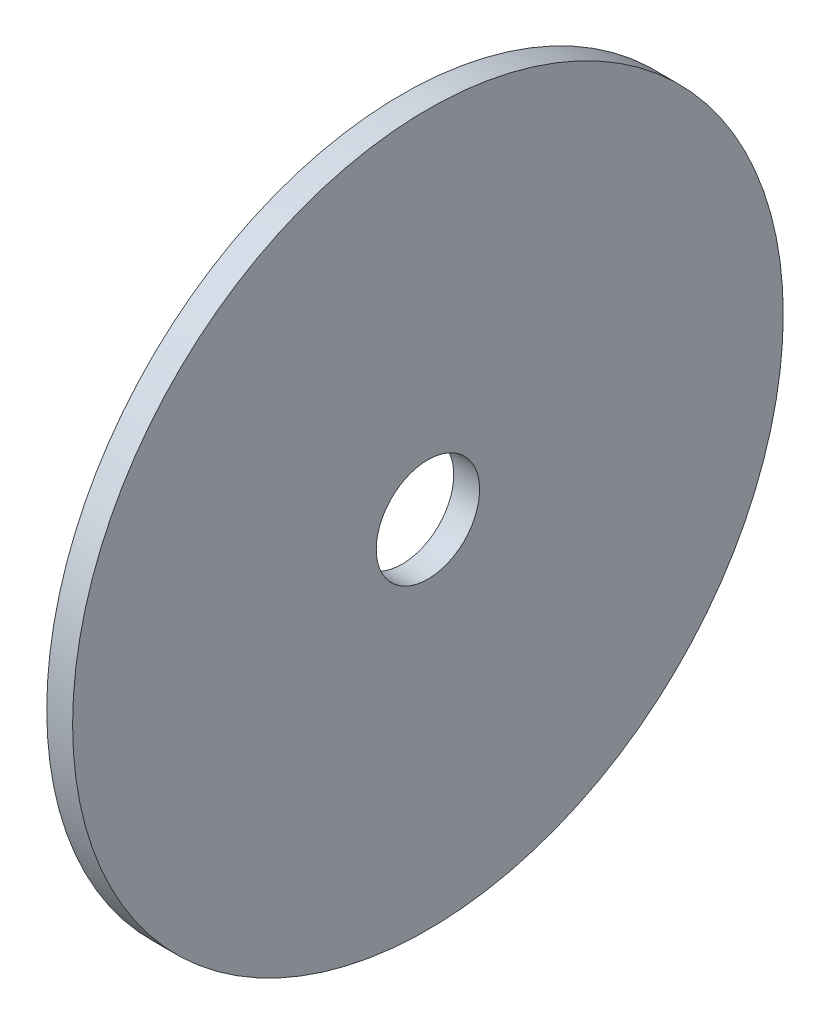
ISO-10303-21;
HEADER;
FILE_DESCRIPTION(('STEP AP214'),'2;1');
FILE_NAME('part.step','',(''),(''),'','','');
FILE_SCHEMA(('AUTOMOTIVE_DESIGN { 1 0 10303 214 1 1 1 1 }'));
ENDSEC;
DATA;
#1=APPLICATION_CONTEXT('core data for automotive mechanical design processes');
#2=APPLICATION_PROTOCOL_DEFINITION('international standard','automotive_design',2000,#1);
#3=PRODUCT_CONTEXT('',#1,'mechanical');
#4=PRODUCT('Part','Part','',(#3));
#5=PRODUCT_RELATED_PRODUCT_CATEGORY('part','',(#4));
#6=PRODUCT_DEFINITION_FORMATION('','',#4);
#7=PRODUCT_DEFINITION_CONTEXT('part definition',#1,'design');
#8=PRODUCT_DEFINITION('design','',#6,#7);
#9=PRODUCT_DEFINITION_SHAPE('','',#8);
#10=(LENGTH_UNIT() NAMED_UNIT(*) SI_UNIT(.MILLI.,.METRE.));
#11=(NAMED_UNIT(*) PLANE_ANGLE_UNIT() SI_UNIT($,.RADIAN.));
#12=(NAMED_UNIT(*) SI_UNIT($,.STERADIAN.) SOLID_ANGLE_UNIT());
#13=UNCERTAINTY_MEASURE_WITH_UNIT(LENGTH_MEASURE(1.E-05),#10,'distance_accuracy_value','');
#14=(GEOMETRIC_REPRESENTATION_CONTEXT(3) GLOBAL_UNCERTAINTY_ASSIGNED_CONTEXT((#13)) GLOBAL_UNIT_ASSIGNED_CONTEXT((#10,
#11,#12)) REPRESENTATION_CONTEXT('',''));
#15=CARTESIAN_POINT('',(0.,0.,0.));
#16=DIRECTION('',(0.,0.,1.));
#17=DIRECTION('',(1.,0.,0.));
#18=AXIS2_PLACEMENT_3D('',#15,#16,#17);
#19=CARTESIAN_POINT('',(-130.,55.,0.));
#20=DIRECTION('',(1.,0.,0.));
#21=DIRECTION('',(0.,0.,-1.));
#22=AXIS2_PLACEMENT_3D('',#19,#20,#21);
#23=PLANE('',#22);
#24=CARTESIAN_POINT('',(-130.,0.,0.));
#25=DIRECTION('',(-1.,0.,0.));
#26=DIRECTION('',(0.,0.,1.));
#27=AXIS2_PLACEMENT_3D('',#24,#25,#26);
#28=CIRCLE('',#27,8.);
#29=CARTESIAN_POINT('',(-130.,0.,8.));
#30=VERTEX_POINT('',#29);
#31=EDGE_CURVE('E10',#30,#30,#28,.T.);
#32=ORIENTED_EDGE('',*,*,#31,.F.);
#33=EDGE_LOOP('',(#32));
#34=FACE_BOUND('',#33,.T.);
#35=CARTESIAN_POINT('',(-130.,0.,0.));
#36=DIRECTION('',(-1.,0.,0.));
#37=DIRECTION('',(0.,0.,1.));
#38=AXIS2_PLACEMENT_3D('',#35,#36,#37);
#39=CIRCLE('',#38,55.);
#40=CARTESIAN_POINT('',(-130.,0.,55.));
#41=VERTEX_POINT('',#40);
#42=EDGE_CURVE('E45',#41,#41,#39,.T.);
#43=ORIENTED_EDGE('',*,*,#42,.T.);
#44=EDGE_LOOP('',(#43));
#45=FACE_BOUND('',#44,.T.);
#46=ADVANCED_FACE('F31',(#34,#45),#23,.F.);
#47=CARTESIAN_POINT('',(-110.,0.,0.));
#48=DIRECTION('',(-1.,0.,0.));
#49=DIRECTION('',(0.,0.,1.));
#50=AXIS2_PLACEMENT_3D('',#47,#48,#49);
#51=CYLINDRICAL_SURFACE('',#50,8.);
#52=CARTESIAN_POINT('',(-126.,0.,0.));
#53=DIRECTION('',(-1.,0.,0.));
#54=DIRECTION('',(0.,0.,1.));
#55=AXIS2_PLACEMENT_3D('',#52,#53,#54);
#56=CIRCLE('',#55,8.);
#57=CARTESIAN_POINT('',(-126.,0.,8.));
#58=VERTEX_POINT('',#57);
#59=EDGE_CURVE('E37',#58,#58,#56,.T.);
#60=ORIENTED_EDGE('',*,*,#59,.F.);
#61=EDGE_LOOP('',(#60));
#62=FACE_BOUND('',#61,.T.);
#63=ORIENTED_EDGE('',*,*,#31,.T.);
#64=EDGE_LOOP('',(#63));
#65=FACE_BOUND('',#64,.T.);
#66=ADVANCED_FACE('F60',(#62,#65),#51,.F.);
#67=CARTESIAN_POINT('',(-126.,8.,0.));
#68=DIRECTION('',(-1.,0.,0.));
#69=DIRECTION('',(0.,0.,1.));
#70=AXIS2_PLACEMENT_3D('',#67,#68,#69);
#71=PLANE('',#70);
#72=CARTESIAN_POINT('',(-126.,0.,0.));
#73=DIRECTION('',(-1.,0.,0.));
#74=DIRECTION('',(0.,0.,1.));
#75=AXIS2_PLACEMENT_3D('',#72,#73,#74);
#76=CIRCLE('',#75,55.);
#77=CARTESIAN_POINT('',(-126.,0.,55.));
#78=VERTEX_POINT('',#77);
#79=EDGE_CURVE('E41',#78,#78,#76,.T.);
#80=ORIENTED_EDGE('',*,*,#79,.F.);
#81=EDGE_LOOP('',(#80));
#82=FACE_BOUND('',#81,.T.);
#83=ORIENTED_EDGE('',*,*,#59,.T.);
#84=EDGE_LOOP('',(#83));
#85=FACE_BOUND('',#84,.T.);
#86=ADVANCED_FACE('F55',(#82,#85),#71,.F.);
#87=CARTESIAN_POINT('',(-110.,0.,0.));
#88=DIRECTION('',(-1.,0.,0.));
#89=DIRECTION('',(0.,0.,1.));
#90=AXIS2_PLACEMENT_3D('',#87,#88,#89);
#91=CYLINDRICAL_SURFACE('',#90,55.);
#92=ORIENTED_EDGE('',*,*,#42,.F.);
#93=EDGE_LOOP('',(#92));
#94=FACE_BOUND('',#93,.T.);
#95=ORIENTED_EDGE('',*,*,#79,.T.);
#96=EDGE_LOOP('',(#95));
#97=FACE_BOUND('',#96,.T.);
#98=ADVANCED_FACE('F52',(#94,#97),#91,.T.);
#99=CLOSED_SHELL('',(#46,#66,#86,#98));
#100=MANIFOLD_SOLID_BREP('B2',#99);
#101=ADVANCED_BREP_SHAPE_REPRESENTATION('',(#18,#100),#14);
#102=SHAPE_DEFINITION_REPRESENTATION(#9,#101);
ENDSEC;
END-ISO-10303-21;
